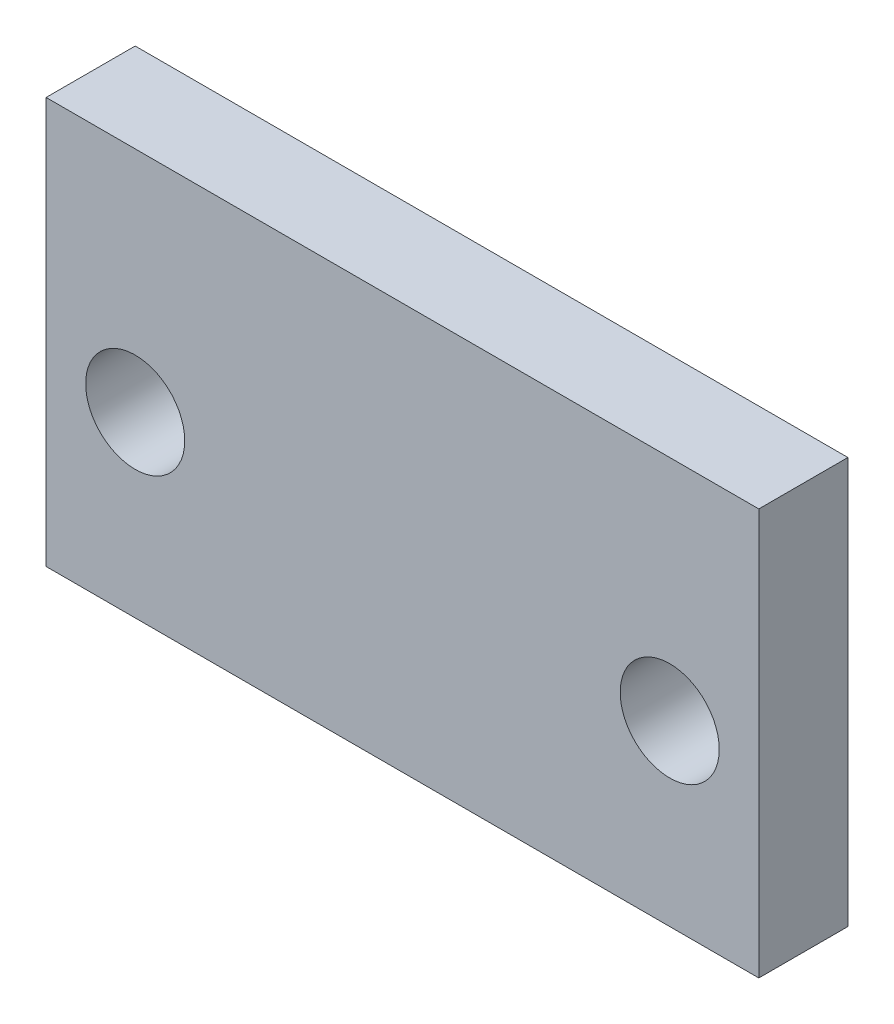
ISO-10303-21;
HEADER;
FILE_DESCRIPTION(('STEP AP214'),'2;1');
FILE_NAME('part.step','',(''),(''),'','','');
FILE_SCHEMA(('AUTOMOTIVE_DESIGN { 1 0 10303 214 1 1 1 1 }'));
ENDSEC;
DATA;
#1=APPLICATION_CONTEXT('core data for automotive mechanical design processes');
#2=APPLICATION_PROTOCOL_DEFINITION('international standard','automotive_design',2000,#1);
#3=PRODUCT_CONTEXT('',#1,'mechanical');
#4=PRODUCT('Part','Part','',(#3));
#5=PRODUCT_RELATED_PRODUCT_CATEGORY('part','',(#4));
#6=PRODUCT_DEFINITION_FORMATION('','',#4);
#7=PRODUCT_DEFINITION_CONTEXT('part definition',#1,'design');
#8=PRODUCT_DEFINITION('design','',#6,#7);
#9=PRODUCT_DEFINITION_SHAPE('','',#8);
#10=(LENGTH_UNIT() NAMED_UNIT(*) SI_UNIT(.MILLI.,.METRE.));
#11=(NAMED_UNIT(*) PLANE_ANGLE_UNIT() SI_UNIT($,.RADIAN.));
#12=(NAMED_UNIT(*) SI_UNIT($,.STERADIAN.) SOLID_ANGLE_UNIT());
#13=UNCERTAINTY_MEASURE_WITH_UNIT(LENGTH_MEASURE(1.E-05),#10,'distance_accuracy_value','');
#14=(GEOMETRIC_REPRESENTATION_CONTEXT(3) GLOBAL_UNCERTAINTY_ASSIGNED_CONTEXT((#13)) GLOBAL_UNIT_ASSIGNED_CONTEXT((#10,
#11,#12)) REPRESENTATION_CONTEXT('',''));
#15=CARTESIAN_POINT('',(0.,0.,0.));
#16=DIRECTION('',(0.,0.,1.));
#17=DIRECTION('',(1.,0.,0.));
#18=AXIS2_PLACEMENT_3D('',#15,#16,#17);
#19=CARTESIAN_POINT('',(-12.7,-7.239,3.175));
#20=DIRECTION('',(0.,0.,1.));
#21=DIRECTION('',(1.,0.,0.));
#22=AXIS2_PLACEMENT_3D('',#19,#20,#21);
#23=PLANE('',#22);
#24=CARTESIAN_POINT('',(-9.525,-0.888999999999997,3.175));
#25=DIRECTION('',(0.,0.,1.));
#26=DIRECTION('',(1.,0.,0.));
#27=AXIS2_PLACEMENT_3D('',#24,#25,#26);
#28=CIRCLE('',#27,1.7653);
#29=CARTESIAN_POINT('',(-7.7597,-0.888999999999997,3.175));
#30=VERTEX_POINT('',#29);
#31=EDGE_CURVE('E431',#30,#30,#28,.T.);
#32=ORIENTED_EDGE('',*,*,#31,.F.);
#33=EDGE_LOOP('',(#32));
#34=FACE_BOUND('',#33,.T.);
#35=DIRECTION('',(0.,-1.,0.));
#36=VECTOR('',#35,1.);
#37=CARTESIAN_POINT('',(-12.7,7.239,3.175));
#38=LINE('',#37,#36);
#39=CARTESIAN_POINT('',(-12.7,7.239,3.175));
#40=VERTEX_POINT('',#39);
#41=CARTESIAN_POINT('',(-12.7,-7.239,3.175));
#42=VERTEX_POINT('',#41);
#43=EDGE_CURVE('E441',#40,#42,#38,.T.);
#44=ORIENTED_EDGE('',*,*,#43,.T.);
#45=DIRECTION('',(1.,0.,0.));
#46=VECTOR('',#45,1.);
#47=CARTESIAN_POINT('',(-12.7,-7.239,3.175));
#48=LINE('',#47,#46);
#49=CARTESIAN_POINT('',(12.7,-7.239,3.175));
#50=VERTEX_POINT('',#49);
#51=EDGE_CURVE('E426',#42,#50,#48,.T.);
#52=ORIENTED_EDGE('',*,*,#51,.T.);
#53=DIRECTION('',(0.,1.,0.));
#54=VECTOR('',#53,1.);
#55=CARTESIAN_POINT('',(12.7,7.239,3.175));
#56=LINE('',#55,#54);
#57=CARTESIAN_POINT('',(12.7,7.239,3.175));
#58=VERTEX_POINT('',#57);
#59=EDGE_CURVE('E392',#50,#58,#56,.T.);
#60=ORIENTED_EDGE('',*,*,#59,.T.);
#61=DIRECTION('',(-1.,0.,0.));
#62=VECTOR('',#61,1.);
#63=CARTESIAN_POINT('',(-12.7,7.239,3.175));
#64=LINE('',#63,#62);
#65=EDGE_CURVE('E387',#58,#40,#64,.T.);
#66=ORIENTED_EDGE('',*,*,#65,.T.);
#67=EDGE_LOOP('',(#44,#52,#60,#66));
#68=FACE_BOUND('',#67,.T.);
#69=CARTESIAN_POINT('',(9.525,-0.888999999999997,3.175));
#70=DIRECTION('',(0.,0.,1.));
#71=DIRECTION('',(1.,0.,0.));
#72=AXIS2_PLACEMENT_3D('',#69,#70,#71);
#73=CIRCLE('',#72,1.7653);
#74=CARTESIAN_POINT('',(11.2903,-0.888999999999997,3.175));
#75=VERTEX_POINT('',#74);
#76=EDGE_CURVE('E459',#75,#75,#73,.T.);
#77=ORIENTED_EDGE('',*,*,#76,.F.);
#78=EDGE_LOOP('',(#77));
#79=FACE_BOUND('',#78,.T.);
#80=ADVANCED_FACE('F372',(#34,#68,#79),#23,.T.);
#81=CARTESIAN_POINT('',(-12.7,-7.239,0.));
#82=DIRECTION('',(0.,0.,1.));
#83=DIRECTION('',(1.,0.,0.));
#84=AXIS2_PLACEMENT_3D('',#81,#82,#83);
#85=PLANE('',#84);
#86=CARTESIAN_POINT('',(-9.525,-0.888999999999997,0.));
#87=DIRECTION('',(0.,0.,1.));
#88=DIRECTION('',(1.,0.,0.));
#89=AXIS2_PLACEMENT_3D('',#86,#87,#88);
#90=CIRCLE('',#89,1.7653);
#91=CARTESIAN_POINT('',(-7.7597,-0.888999999999997,0.));
#92=VERTEX_POINT('',#91);
#93=EDGE_CURVE('E434',#92,#92,#90,.T.);
#94=ORIENTED_EDGE('',*,*,#93,.T.);
#95=EDGE_LOOP('',(#94));
#96=FACE_BOUND('',#95,.T.);
#97=DIRECTION('',(0.,-1.,0.));
#98=VECTOR('',#97,1.);
#99=CARTESIAN_POINT('',(-12.7,7.239,0.));
#100=LINE('',#99,#98);
#101=CARTESIAN_POINT('',(-12.7,7.239,0.));
#102=VERTEX_POINT('',#101);
#103=CARTESIAN_POINT('',(-12.7,-7.239,0.));
#104=VERTEX_POINT('',#103);
#105=EDGE_CURVE('E418',#102,#104,#100,.T.);
#106=ORIENTED_EDGE('',*,*,#105,.F.);
#107=DIRECTION('',(-1.,0.,0.));
#108=VECTOR('',#107,1.);
#109=CARTESIAN_POINT('',(-12.7,7.239,0.));
#110=LINE('',#109,#108);
#111=CARTESIAN_POINT('',(12.7,7.239,0.));
#112=VERTEX_POINT('',#111);
#113=EDGE_CURVE('E439',#112,#102,#110,.T.);
#114=ORIENTED_EDGE('',*,*,#113,.F.);
#115=DIRECTION('',(0.,1.,0.));
#116=VECTOR('',#115,1.);
#117=CARTESIAN_POINT('',(12.7,7.239,0.));
#118=LINE('',#117,#116);
#119=CARTESIAN_POINT('',(12.7,-7.239,0.));
#120=VERTEX_POINT('',#119);
#121=EDGE_CURVE('E419',#120,#112,#118,.T.);
#122=ORIENTED_EDGE('',*,*,#121,.F.);
#123=DIRECTION('',(1.,0.,0.));
#124=VECTOR('',#123,1.);
#125=CARTESIAN_POINT('',(-12.7,-7.239,0.));
#126=LINE('',#125,#124);
#127=EDGE_CURVE('E413',#104,#120,#126,.T.);
#128=ORIENTED_EDGE('',*,*,#127,.F.);
#129=EDGE_LOOP('',(#106,#114,#122,#128));
#130=FACE_BOUND('',#129,.T.);
#131=CARTESIAN_POINT('',(9.525,-0.888999999999997,0.));
#132=DIRECTION('',(0.,0.,1.));
#133=DIRECTION('',(1.,0.,0.));
#134=AXIS2_PLACEMENT_3D('',#131,#132,#133);
#135=CIRCLE('',#134,1.7653);
#136=CARTESIAN_POINT('',(11.2903,-0.888999999999997,0.));
#137=VERTEX_POINT('',#136);
#138=EDGE_CURVE('E461',#137,#137,#135,.T.);
#139=ORIENTED_EDGE('',*,*,#138,.T.);
#140=EDGE_LOOP('',(#139));
#141=FACE_BOUND('',#140,.T.);
#142=ADVANCED_FACE('F414',(#96,#130,#141),#85,.F.);
#143=CARTESIAN_POINT('',(-12.7,7.239,3.175));
#144=DIRECTION('',(1.,0.,0.));
#145=DIRECTION('',(0.,0.,-1.));
#146=AXIS2_PLACEMENT_3D('',#143,#144,#145);
#147=PLANE('',#146);
#148=ORIENTED_EDGE('',*,*,#105,.T.);
#149=DIRECTION('',(0.,0.,-1.));
#150=VECTOR('',#149,1.);
#151=CARTESIAN_POINT('',(-12.7,-7.239,3.175));
#152=LINE('',#151,#150);
#153=EDGE_CURVE('E11',#42,#104,#152,.T.);
#154=ORIENTED_EDGE('',*,*,#153,.F.);
#155=ORIENTED_EDGE('',*,*,#43,.F.);
#156=DIRECTION('',(0.,0.,-1.));
#157=VECTOR('',#156,1.);
#158=CARTESIAN_POINT('',(-12.7,7.239,3.175));
#159=LINE('',#158,#157);
#160=EDGE_CURVE('E430',#40,#102,#159,.T.);
#161=ORIENTED_EDGE('',*,*,#160,.T.);
#162=EDGE_LOOP('',(#148,#154,#155,#161));
#163=FACE_BOUND('',#162,.T.);
#164=ADVANCED_FACE('F374',(#163),#147,.F.);
#165=CARTESIAN_POINT('',(-12.7,-7.239,3.175));
#166=DIRECTION('',(0.,1.,0.));
#167=DIRECTION('',(0.,0.,1.));
#168=AXIS2_PLACEMENT_3D('',#165,#166,#167);
#169=PLANE('',#168);
#170=ORIENTED_EDGE('',*,*,#127,.T.);
#171=DIRECTION('',(0.,0.,-1.));
#172=VECTOR('',#171,1.);
#173=CARTESIAN_POINT('',(12.7,-7.239,3.175));
#174=LINE('',#173,#172);
#175=EDGE_CURVE('E380',#50,#120,#174,.T.);
#176=ORIENTED_EDGE('',*,*,#175,.F.);
#177=ORIENTED_EDGE('',*,*,#51,.F.);
#178=ORIENTED_EDGE('',*,*,#153,.T.);
#179=EDGE_LOOP('',(#170,#176,#177,#178));
#180=FACE_BOUND('',#179,.T.);
#181=ADVANCED_FACE('F425',(#180),#169,.F.);
#182=CARTESIAN_POINT('',(12.7,7.239,3.175));
#183=DIRECTION('',(-1.,0.,0.));
#184=DIRECTION('',(0.,-1.,0.));
#185=AXIS2_PLACEMENT_3D('',#182,#183,#184);
#186=PLANE('',#185);
#187=ORIENTED_EDGE('',*,*,#121,.T.);
#188=DIRECTION('',(0.,0.,-1.));
#189=VECTOR('',#188,1.);
#190=CARTESIAN_POINT('',(12.7,7.239,3.175));
#191=LINE('',#190,#189);
#192=EDGE_CURVE('E447',#58,#112,#191,.T.);
#193=ORIENTED_EDGE('',*,*,#192,.F.);
#194=ORIENTED_EDGE('',*,*,#59,.F.);
#195=ORIENTED_EDGE('',*,*,#175,.T.);
#196=EDGE_LOOP('',(#187,#193,#194,#195));
#197=FACE_BOUND('',#196,.T.);
#198=ADVANCED_FACE('F450',(#197),#186,.F.);
#199=CARTESIAN_POINT('',(-12.7,7.239,3.175));
#200=DIRECTION('',(0.,-1.,0.));
#201=DIRECTION('',(0.,0.,-1.));
#202=AXIS2_PLACEMENT_3D('',#199,#200,#201);
#203=PLANE('',#202);
#204=ORIENTED_EDGE('',*,*,#113,.T.);
#205=ORIENTED_EDGE('',*,*,#160,.F.);
#206=ORIENTED_EDGE('',*,*,#65,.F.);
#207=ORIENTED_EDGE('',*,*,#192,.T.);
#208=EDGE_LOOP('',(#204,#205,#206,#207));
#209=FACE_BOUND('',#208,.T.);
#210=ADVANCED_FACE('F452',(#209),#203,.F.);
#211=CARTESIAN_POINT('',(-9.525,-0.888999999999997,3.175));
#212=DIRECTION('',(0.,0.,-1.));
#213=DIRECTION('',(-1.,0.,0.));
#214=AXIS2_PLACEMENT_3D('',#211,#212,#213);
#215=CYLINDRICAL_SURFACE('',#214,1.7653);
#216=ORIENTED_EDGE('',*,*,#31,.T.);
#217=EDGE_LOOP('',(#216));
#218=FACE_BOUND('',#217,.T.);
#219=ORIENTED_EDGE('',*,*,#93,.F.);
#220=EDGE_LOOP('',(#219));
#221=FACE_BOUND('',#220,.T.);
#222=ADVANCED_FACE('F470',(#218,#221),#215,.F.);
#223=CARTESIAN_POINT('',(9.525,-0.888999999999997,3.175));
#224=DIRECTION('',(0.,0.,-1.));
#225=DIRECTION('',(-1.,0.,0.));
#226=AXIS2_PLACEMENT_3D('',#223,#224,#225);
#227=CYLINDRICAL_SURFACE('',#226,1.7653);
#228=ORIENTED_EDGE('',*,*,#76,.T.);
#229=EDGE_LOOP('',(#228));
#230=FACE_BOUND('',#229,.T.);
#231=ORIENTED_EDGE('',*,*,#138,.F.);
#232=EDGE_LOOP('',(#231));
#233=FACE_BOUND('',#232,.T.);
#234=ADVANCED_FACE('F468',(#230,#233),#227,.F.);
#235=CLOSED_SHELL('',(#80,#142,#164,#181,#198,#210,#222,#234));
#236=MANIFOLD_SOLID_BREP('B2',#235);
#237=ADVANCED_BREP_SHAPE_REPRESENTATION('',(#18,#236),#14);
#238=SHAPE_DEFINITION_REPRESENTATION(#9,#237);
ENDSEC;
END-ISO-10303-21;
